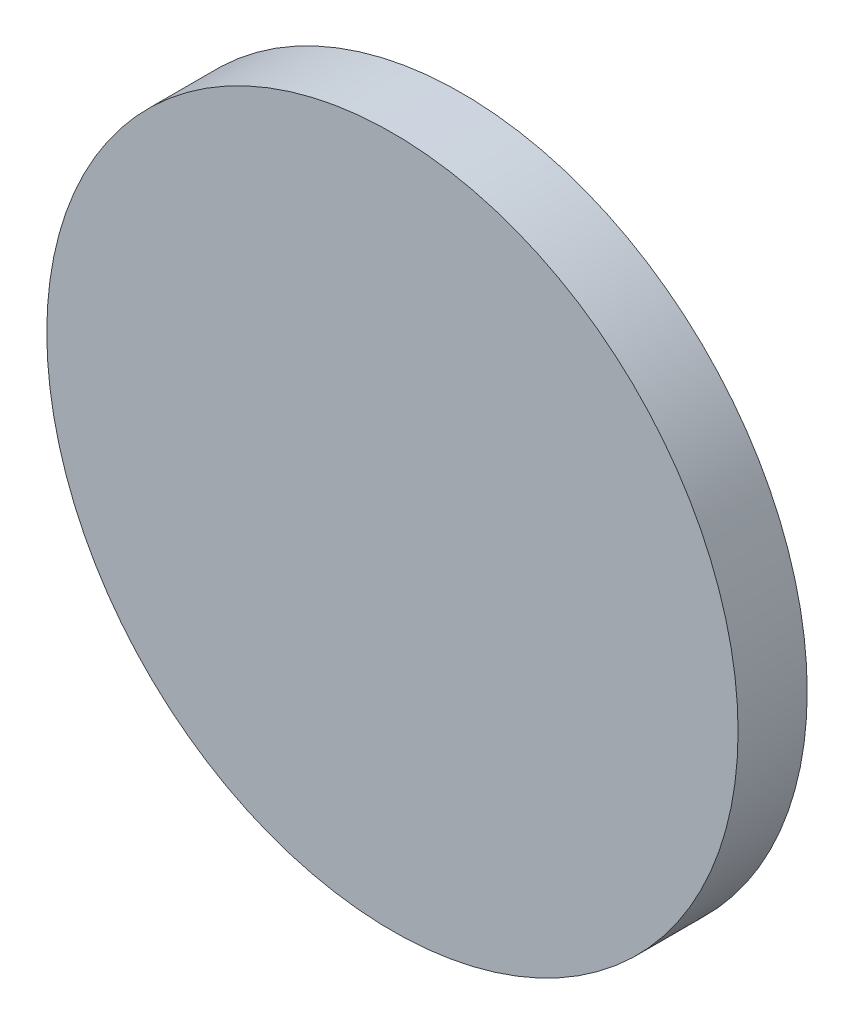
ISO-10303-21;
HEADER;
FILE_DESCRIPTION(('STEP AP214'),'2;1');
FILE_NAME('part.step','',(''),(''),'','','');
FILE_SCHEMA(('AUTOMOTIVE_DESIGN { 1 0 10303 214 1 1 1 1 }'));
ENDSEC;
DATA;
#1=APPLICATION_CONTEXT('core data for automotive mechanical design processes');
#2=APPLICATION_PROTOCOL_DEFINITION('international standard','automotive_design',2000,#1);
#3=PRODUCT_CONTEXT('',#1,'mechanical');
#4=PRODUCT('Part','Part','',(#3));
#5=PRODUCT_RELATED_PRODUCT_CATEGORY('part','',(#4));
#6=PRODUCT_DEFINITION_FORMATION('','',#4);
#7=PRODUCT_DEFINITION_CONTEXT('part definition',#1,'design');
#8=PRODUCT_DEFINITION('design','',#6,#7);
#9=PRODUCT_DEFINITION_SHAPE('','',#8);
#10=(LENGTH_UNIT() NAMED_UNIT(*) SI_UNIT(.MILLI.,.METRE.));
#11=(NAMED_UNIT(*) PLANE_ANGLE_UNIT() SI_UNIT($,.RADIAN.));
#12=(NAMED_UNIT(*) SI_UNIT($,.STERADIAN.) SOLID_ANGLE_UNIT());
#13=UNCERTAINTY_MEASURE_WITH_UNIT(LENGTH_MEASURE(1.E-05),#10,'distance_accuracy_value','');
#14=(GEOMETRIC_REPRESENTATION_CONTEXT(3) GLOBAL_UNCERTAINTY_ASSIGNED_CONTEXT((#13)) GLOBAL_UNIT_ASSIGNED_CONTEXT((#10,
#11,#12)) REPRESENTATION_CONTEXT('',''));
#15=CARTESIAN_POINT('',(0.,0.,0.));
#16=DIRECTION('',(0.,0.,1.));
#17=DIRECTION('',(1.,0.,0.));
#18=AXIS2_PLACEMENT_3D('',#15,#16,#17);
#19=CARTESIAN_POINT('',(-62.3905807956923,-116.,-1.5));
#20=DIRECTION('',(0.,0.,1.));
#21=DIRECTION('',(1.,0.,0.));
#22=AXIS2_PLACEMENT_3D('',#19,#20,#21);
#23=CYLINDRICAL_SURFACE('',#22,7.50000000000001);
#24=CARTESIAN_POINT('',(-62.3905807956923,-116.,-1.5));
#25=DIRECTION('',(0.,0.,1.));
#26=DIRECTION('',(1.,0.,0.));
#27=AXIS2_PLACEMENT_3D('',#24,#25,#26);
#28=CIRCLE('',#27,7.50000000000001);
#29=CARTESIAN_POINT('',(-54.8905807956923,-116.,-1.5));
#30=VERTEX_POINT('',#29);
#31=EDGE_CURVE('E10',#30,#30,#28,.T.);
#32=ORIENTED_EDGE('',*,*,#31,.T.);
#33=EDGE_LOOP('',(#32));
#34=FACE_BOUND('',#33,.T.);
#35=CARTESIAN_POINT('',(-62.3905807956923,-116.,0.));
#36=DIRECTION('',(0.,0.,1.));
#37=DIRECTION('',(1.,0.,0.));
#38=AXIS2_PLACEMENT_3D('',#35,#36,#37);
#39=CIRCLE('',#38,7.50000000000001);
#40=CARTESIAN_POINT('',(-54.8905807956923,-116.,0.));
#41=VERTEX_POINT('',#40);
#42=EDGE_CURVE('E36',#41,#41,#39,.T.);
#43=ORIENTED_EDGE('',*,*,#42,.F.);
#44=EDGE_LOOP('',(#43));
#45=FACE_BOUND('',#44,.T.);
#46=ADVANCED_FACE('F33',(#34,#45),#23,.T.);
#47=CARTESIAN_POINT('',(-62.3905807956923,-116.,-1.5));
#48=DIRECTION('',(0.,0.,1.));
#49=DIRECTION('',(1.,0.,0.));
#50=AXIS2_PLACEMENT_3D('',#47,#48,#49);
#51=PLANE('',#50);
#52=ORIENTED_EDGE('',*,*,#31,.F.);
#53=EDGE_LOOP('',(#52));
#54=FACE_BOUND('',#53,.T.);
#55=ADVANCED_FACE('F48',(#54),#51,.F.);
#56=CARTESIAN_POINT('',(-62.3905807956923,-116.,0.));
#57=DIRECTION('',(0.,0.,1.));
#58=DIRECTION('',(1.,0.,0.));
#59=AXIS2_PLACEMENT_3D('',#56,#57,#58);
#60=PLANE('',#59);
#61=ORIENTED_EDGE('',*,*,#42,.T.);
#62=EDGE_LOOP('',(#61));
#63=FACE_BOUND('',#62,.T.);
#64=ADVANCED_FACE('F45',(#63),#60,.T.);
#65=CLOSED_SHELL('',(#46,#55,#64));
#66=MANIFOLD_SOLID_BREP('B2',#65);
#67=ADVANCED_BREP_SHAPE_REPRESENTATION('',(#18,#66),#14);
#68=SHAPE_DEFINITION_REPRESENTATION(#9,#67);
ENDSEC;
END-ISO-10303-21;
